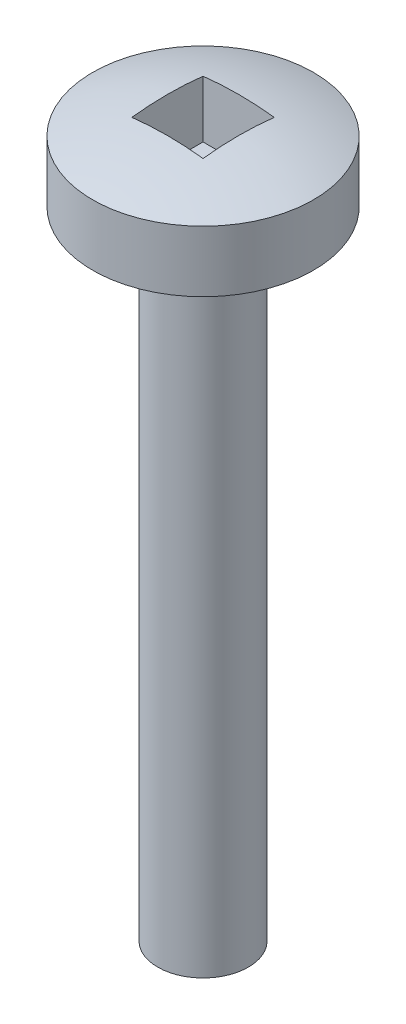
ISO-10303-21;
HEADER;
FILE_DESCRIPTION(('STEP AP214'),'2;1');
FILE_NAME('part.step','',(''),(''),'','','');
FILE_SCHEMA(('AUTOMOTIVE_DESIGN { 1 0 10303 214 1 1 1 1 }'));
ENDSEC;
DATA;
#1=APPLICATION_CONTEXT('core data for automotive mechanical design processes');
#2=APPLICATION_PROTOCOL_DEFINITION('international standard','automotive_design',2000,#1);
#3=PRODUCT_CONTEXT('',#1,'mechanical');
#4=PRODUCT('Part','Part','',(#3));
#5=PRODUCT_RELATED_PRODUCT_CATEGORY('part','',(#4));
#6=PRODUCT_DEFINITION_FORMATION('','',#4);
#7=PRODUCT_DEFINITION_CONTEXT('part definition',#1,'design');
#8=PRODUCT_DEFINITION('design','',#6,#7);
#9=PRODUCT_DEFINITION_SHAPE('','',#8);
#10=(LENGTH_UNIT() NAMED_UNIT(*) SI_UNIT(.MILLI.,.METRE.));
#11=(NAMED_UNIT(*) PLANE_ANGLE_UNIT() SI_UNIT($,.RADIAN.));
#12=(NAMED_UNIT(*) SI_UNIT($,.STERADIAN.) SOLID_ANGLE_UNIT());
#13=UNCERTAINTY_MEASURE_WITH_UNIT(LENGTH_MEASURE(1.E-05),#10,'distance_accuracy_value','');
#14=(GEOMETRIC_REPRESENTATION_CONTEXT(3) GLOBAL_UNCERTAINTY_ASSIGNED_CONTEXT((#13)) GLOBAL_UNIT_ASSIGNED_CONTEXT((#10,
#11,#12)) REPRESENTATION_CONTEXT('',''));
#15=CARTESIAN_POINT('',(0.,0.,0.));
#16=DIRECTION('',(0.,0.,1.));
#17=DIRECTION('',(1.,0.,0.));
#18=AXIS2_PLACEMENT_3D('',#15,#16,#17);
#19=CARTESIAN_POINT('',(0.,-15.875,0.));
#20=DIRECTION('',(0.,1.,0.));
#21=DIRECTION('',(0.,0.,1.));
#22=AXIS2_PLACEMENT_3D('',#19,#20,#21);
#23=CYLINDRICAL_SURFACE('',#22,1.1303);
#24=CARTESIAN_POINT('',(0.,-15.875,0.));
#25=DIRECTION('',(0.,1.,0.));
#26=DIRECTION('',(0.,0.,1.));
#27=AXIS2_PLACEMENT_3D('',#24,#25,#26);
#28=CIRCLE('',#27,1.1303);
#29=CARTESIAN_POINT('',(0.,-15.875,1.1303));
#30=VERTEX_POINT('',#29);
#31=EDGE_CURVE('E104',#30,#30,#28,.T.);
#32=ORIENTED_EDGE('',*,*,#31,.T.);
#33=EDGE_LOOP('',(#32));
#34=FACE_BOUND('',#33,.T.);
#35=CARTESIAN_POINT('',(0.,0.,0.));
#36=DIRECTION('',(0.,1.,0.));
#37=DIRECTION('',(0.,0.,1.));
#38=AXIS2_PLACEMENT_3D('',#35,#36,#37);
#39=CIRCLE('',#38,1.1303);
#40=CARTESIAN_POINT('',(0.,0.,1.1303));
#41=VERTEX_POINT('',#40);
#42=EDGE_CURVE('E108',#41,#41,#39,.T.);
#43=ORIENTED_EDGE('',*,*,#42,.F.);
#44=EDGE_LOOP('',(#43));
#45=FACE_BOUND('',#44,.T.);
#46=ADVANCED_FACE('F32',(#34,#45),#23,.T.);
#47=CARTESIAN_POINT('',(0.,-15.875,0.));
#48=DIRECTION('',(0.,1.,0.));
#49=DIRECTION('',(0.,0.,1.));
#50=AXIS2_PLACEMENT_3D('',#47,#48,#49);
#51=PLANE('',#50);
#52=ORIENTED_EDGE('',*,*,#31,.F.);
#53=EDGE_LOOP('',(#52));
#54=FACE_BOUND('',#53,.T.);
#55=ADVANCED_FACE('F128',(#54),#51,.F.);
#56=CARTESIAN_POINT('',(0.,1.524,0.));
#57=DIRECTION('',(0.,-1.,0.));
#58=DIRECTION('',(0.,0.,-1.));
#59=AXIS2_PLACEMENT_3D('',#56,#57,#58);
#60=CYLINDRICAL_SURFACE('',#59,2.7559);
#61=CARTESIAN_POINT('',(0.,1.524,0.));
#62=DIRECTION('',(0.,1.,0.));
#63=DIRECTION('',(0.,0.,1.));
#64=AXIS2_PLACEMENT_3D('',#61,#62,#63);
#65=CIRCLE('',#64,2.7559);
#66=CARTESIAN_POINT('',(0.,1.524,-2.7559));
#67=VERTEX_POINT('',#66);
#68=EDGE_CURVE('E103',#67,#67,#65,.T.);
#69=CARTESIAN_POINT('',(0.,0.,0.));
#70=DIRECTION('',(0.,1.,0.));
#71=DIRECTION('',(0.,0.,1.));
#72=AXIS2_PLACEMENT_3D('',#69,#70,#71);
#73=CIRCLE('',#72,2.7559);
#74=CARTESIAN_POINT('',(0.,0.,-2.7559));
#75=VERTEX_POINT('',#74);
#76=EDGE_CURVE('E97',#75,#75,#73,.T.);
#77=CARTESIAN_POINT('',(0.,1.524,-2.7559));
#78=CARTESIAN_POINT('',(0.,1.508125,-2.7559));
#79=CARTESIAN_POINT('',(0.,1.49225,-2.7559));
#80=CARTESIAN_POINT('',(0.,1.4605,-2.7559));
#81=CARTESIAN_POINT('',(0.,1.444625,-2.7559));
#82=CARTESIAN_POINT('',(0.,1.412875,-2.7559));
#83=CARTESIAN_POINT('',(0.,1.397,-2.7559));
#84=CARTESIAN_POINT('',(0.,1.36525,-2.7559));
#85=CARTESIAN_POINT('',(0.,1.349375,-2.7559));
#86=CARTESIAN_POINT('',(0.,1.317625,-2.7559));
#87=CARTESIAN_POINT('',(0.,1.30175,-2.7559));
#88=CARTESIAN_POINT('',(0.,1.27,-2.7559));
#89=CARTESIAN_POINT('',(0.,1.254125,-2.7559));
#90=CARTESIAN_POINT('',(0.,1.222375,-2.7559));
#91=CARTESIAN_POINT('',(0.,1.2065,-2.7559));
#92=CARTESIAN_POINT('',(0.,1.17475,-2.7559));
#93=CARTESIAN_POINT('',(0.,1.158875,-2.7559));
#94=CARTESIAN_POINT('',(0.,1.127125,-2.7559));
#95=CARTESIAN_POINT('',(0.,1.11125,-2.7559));
#96=CARTESIAN_POINT('',(0.,1.0795,-2.7559));
#97=CARTESIAN_POINT('',(0.,1.063625,-2.7559));
#98=CARTESIAN_POINT('',(0.,1.031875,-2.7559));
#99=CARTESIAN_POINT('',(0.,1.016,-2.7559));
#100=CARTESIAN_POINT('',(0.,0.98425,-2.7559));
#101=CARTESIAN_POINT('',(0.,0.968375,-2.7559));
#102=CARTESIAN_POINT('',(0.,0.936625,-2.7559));
#103=CARTESIAN_POINT('',(0.,0.92075,-2.7559));
#104=CARTESIAN_POINT('',(0.,0.889,-2.7559));
#105=CARTESIAN_POINT('',(0.,0.873125,-2.7559));
#106=CARTESIAN_POINT('',(0.,0.841375,-2.7559));
#107=CARTESIAN_POINT('',(0.,0.8255,-2.7559));
#108=CARTESIAN_POINT('',(0.,0.79375,-2.7559));
#109=CARTESIAN_POINT('',(0.,0.777875,-2.7559));
#110=CARTESIAN_POINT('',(0.,0.746125,-2.7559));
#111=CARTESIAN_POINT('',(0.,0.73025,-2.7559));
#112=CARTESIAN_POINT('',(0.,0.6985,-2.7559));
#113=CARTESIAN_POINT('',(0.,0.682625,-2.7559));
#114=CARTESIAN_POINT('',(0.,0.650875,-2.7559));
#115=CARTESIAN_POINT('',(0.,0.635,-2.7559));
#116=CARTESIAN_POINT('',(0.,0.60325,-2.7559));
#117=CARTESIAN_POINT('',(0.,0.587375,-2.7559));
#118=CARTESIAN_POINT('',(0.,0.555625,-2.7559));
#119=CARTESIAN_POINT('',(0.,0.53975,-2.7559));
#120=CARTESIAN_POINT('',(0.,0.508,-2.7559));
#121=CARTESIAN_POINT('',(0.,0.492125,-2.7559));
#122=CARTESIAN_POINT('',(0.,0.460375,-2.7559));
#123=CARTESIAN_POINT('',(0.,0.4445,-2.7559));
#124=CARTESIAN_POINT('',(0.,0.41275,-2.7559));
#125=CARTESIAN_POINT('',(0.,0.396875,-2.7559));
#126=CARTESIAN_POINT('',(0.,0.365125,-2.7559));
#127=CARTESIAN_POINT('',(0.,0.34925,-2.7559));
#128=CARTESIAN_POINT('',(0.,0.3175,-2.7559));
#129=CARTESIAN_POINT('',(0.,0.301625,-2.7559));
#130=CARTESIAN_POINT('',(0.,0.269875,-2.7559));
#131=CARTESIAN_POINT('',(0.,0.254,-2.7559));
#132=CARTESIAN_POINT('',(0.,0.22225,-2.7559));
#133=CARTESIAN_POINT('',(0.,0.206375,-2.7559));
#134=CARTESIAN_POINT('',(0.,0.174625,-2.7559));
#135=CARTESIAN_POINT('',(0.,0.15875,-2.7559));
#136=CARTESIAN_POINT('',(0.,0.127,-2.7559));
#137=CARTESIAN_POINT('',(0.,0.111125,-2.7559));
#138=CARTESIAN_POINT('',(0.,0.079375,-2.7559));
#139=CARTESIAN_POINT('',(0.,0.0635,-2.7559));
#140=CARTESIAN_POINT('',(0.,0.0317499999999999,-2.7559));
#141=CARTESIAN_POINT('',(0.,0.015875,-2.7559));
#142=CARTESIAN_POINT('',(0.,0.,-2.7559));
#143=B_SPLINE_CURVE_WITH_KNOTS('',3,(#77,#78,#79,#80,#81,#82,#83,#84,#85,#86,#87,#88,#89,#90,
#91,#92,#93,#94,#95,#96,#97,#98,#99,#100,#101,#102,#103,#104,#105,#106,#107,#108,#109,#110,#111,
#112,#113,#114,#115,#116,#117,#118,#119,#120,#121,#122,#123,#124,#125,#126,#127,#128,#129,#130,
#131,#132,#133,#134,#135,#136,#137,#138,#139,#140,#141,#142),.UNSPECIFIED.,.F.,.F.,(4,2,2,2,2,2,
2,2,2,2,2,2,2,2,2,2,2,2,2,2,2,2,2,2,2,2,2,2,2,2,2,2,4),(0.,0.0476250000000001,
0.0952500000000001,0.142875,0.1905,0.238125,0.28575,0.333375,0.381,0.428625,0.47625,0.523875,
0.5715,0.619125,0.66675,0.714375,0.762,0.809625,0.85725,0.904875,0.9525,1.000125,1.04775,
1.095375,1.143,1.190625,1.23825,1.285875,1.3335,1.381125,1.42875,1.476375,1.524),.UNSPECIFIED.);
#144=EDGE_CURVE('BSEAM123',#67,#75,#143,.T.);
#145=ORIENTED_EDGE('',*,*,#68,.F.);
#146=ORIENTED_EDGE('',*,*,#76,.T.);
#147=ORIENTED_EDGE('',*,*,#144,.T.);
#148=ORIENTED_EDGE('',*,*,#144,.F.);
#149=EDGE_LOOP('',(#145,#147,#146,#148));
#150=FACE_BOUND('',#149,.T.);
#151=ADVANCED_FACE('F123',(#150),#60,.T.);
#152=CARTESIAN_POINT('',(0.,-5.69737875,0.));
#153=DIRECTION('',(0.,0.,1.));
#154=DIRECTION('',(1.,0.,0.));
#155=AXIS2_PLACEMENT_3D('',#152,#153,#154);
#156=SPHERICAL_SURFACE('',#155,7.72937875);
#157=CARTESIAN_POINT('',(0.889,-5.69737875,0.));
#158=DIRECTION('',(1.,0.,0.));
#159=DIRECTION('',(0.,0.,-1.));
#160=AXIS2_PLACEMENT_3D('',#157,#158,#159);
#161=CIRCLE('',#160,7.67808406185759);
#162=CARTESIAN_POINT('',(0.889,1.92906562867028,0.889));
#163=VERTEX_POINT('',#162);
#164=CARTESIAN_POINT('',(0.889,1.92906562867028,-0.889));
#165=VERTEX_POINT('',#164);
#166=EDGE_CURVE('E11',#163,#165,#161,.F.);
#167=ORIENTED_EDGE('',*,*,#166,.F.);
#168=CARTESIAN_POINT('',(0.,-5.69737875,0.889));
#169=DIRECTION('',(0.,0.,1.));
#170=DIRECTION('',(1.,0.,0.));
#171=AXIS2_PLACEMENT_3D('',#168,#169,#170);
#172=CIRCLE('',#171,7.67808406185759);
#173=CARTESIAN_POINT('',(-0.889,1.92906562867028,0.888999999999999));
#174=VERTEX_POINT('',#173);
#175=EDGE_CURVE('E40',#174,#163,#172,.F.);
#176=ORIENTED_EDGE('',*,*,#175,.F.);
#177=CARTESIAN_POINT('',(-0.889,-5.69737875,0.));
#178=DIRECTION('',(-1.,0.,0.));
#179=DIRECTION('',(0.,0.,1.));
#180=AXIS2_PLACEMENT_3D('',#177,#178,#179);
#181=CIRCLE('',#180,7.67808406185759);
#182=CARTESIAN_POINT('',(-0.888999999999999,1.92906562867028,-0.889));
#183=VERTEX_POINT('',#182);
#184=EDGE_CURVE('E114',#183,#174,#181,.F.);
#185=ORIENTED_EDGE('',*,*,#184,.F.);
#186=CARTESIAN_POINT('',(0.,-5.69737875,-0.889));
#187=DIRECTION('',(0.,0.,-1.));
#188=DIRECTION('',(-1.,0.,0.));
#189=AXIS2_PLACEMENT_3D('',#186,#187,#188);
#190=CIRCLE('',#189,7.67808406185759);
#191=EDGE_CURVE('E107',#165,#183,#190,.F.);
#192=ORIENTED_EDGE('',*,*,#191,.F.);
#193=EDGE_LOOP('',(#167,#176,#185,#192));
#194=FACE_BOUND('',#193,.T.);
#195=ORIENTED_EDGE('',*,*,#68,.T.);
#196=EDGE_LOOP('',(#195));
#197=FACE_BOUND('',#196,.T.);
#198=ADVANCED_FACE('F34',(#194,#197),#156,.T.);
#199=CARTESIAN_POINT('',(0.,0.,0.));
#200=DIRECTION('',(0.,1.,0.));
#201=DIRECTION('',(0.,0.,1.));
#202=AXIS2_PLACEMENT_3D('',#199,#200,#201);
#203=PLANE('',#202);
#204=ORIENTED_EDGE('',*,*,#42,.T.);
#205=EDGE_LOOP('',(#204));
#206=FACE_BOUND('',#205,.T.);
#207=ORIENTED_EDGE('',*,*,#76,.F.);
#208=EDGE_LOOP('',(#207));
#209=FACE_BOUND('',#208,.T.);
#210=ADVANCED_FACE('F122',(#206,#209),#203,.F.);
#211=CARTESIAN_POINT('',(0.889,0.508,0.889));
#212=DIRECTION('',(1.,0.,0.));
#213=DIRECTION('',(0.,0.,-1.));
#214=AXIS2_PLACEMENT_3D('',#211,#212,#213);
#215=PLANE('',#214);
#216=ORIENTED_EDGE('',*,*,#166,.T.);
#217=DIRECTION('',(0.,1.,0.));
#218=VECTOR('',#217,1.);
#219=CARTESIAN_POINT('',(0.889,0.508,-0.889));
#220=LINE('',#219,#218);
#221=CARTESIAN_POINT('',(0.889,0.508,-0.889));
#222=VERTEX_POINT('',#221);
#223=EDGE_CURVE('E47',#222,#165,#220,.T.);
#224=ORIENTED_EDGE('',*,*,#223,.F.);
#225=DIRECTION('',(0.,0.,-1.));
#226=VECTOR('',#225,1.);
#227=CARTESIAN_POINT('',(0.889,0.508,0.889));
#228=LINE('',#227,#226);
#229=CARTESIAN_POINT('',(0.889,0.508,0.889));
#230=VERTEX_POINT('',#229);
#231=EDGE_CURVE('E73',#230,#222,#228,.T.);
#232=ORIENTED_EDGE('',*,*,#231,.F.);
#233=DIRECTION('',(0.,1.,0.));
#234=VECTOR('',#233,1.);
#235=CARTESIAN_POINT('',(0.889,0.508,0.889));
#236=LINE('',#235,#234);
#237=EDGE_CURVE('E95',#230,#163,#236,.T.);
#238=ORIENTED_EDGE('',*,*,#237,.T.);
#239=EDGE_LOOP('',(#216,#224,#232,#238));
#240=FACE_BOUND('',#239,.T.);
#241=ADVANCED_FACE('F71',(#240),#215,.F.);
#242=CARTESIAN_POINT('',(-0.889,0.508,0.889));
#243=DIRECTION('',(0.,0.,1.));
#244=DIRECTION('',(1.,0.,0.));
#245=AXIS2_PLACEMENT_3D('',#242,#243,#244);
#246=PLANE('',#245);
#247=ORIENTED_EDGE('',*,*,#175,.T.);
#248=ORIENTED_EDGE('',*,*,#237,.F.);
#249=DIRECTION('',(1.,0.,0.));
#250=VECTOR('',#249,1.);
#251=CARTESIAN_POINT('',(-0.889,0.508,0.889));
#252=LINE('',#251,#250);
#253=CARTESIAN_POINT('',(-0.889,0.508,0.889));
#254=VERTEX_POINT('',#253);
#255=EDGE_CURVE('E78',#254,#230,#252,.T.);
#256=ORIENTED_EDGE('',*,*,#255,.F.);
#257=DIRECTION('',(0.,1.,0.));
#258=VECTOR('',#257,1.);
#259=CARTESIAN_POINT('',(-0.889,0.508,0.889));
#260=LINE('',#259,#258);
#261=EDGE_CURVE('E98',#254,#174,#260,.T.);
#262=ORIENTED_EDGE('',*,*,#261,.T.);
#263=EDGE_LOOP('',(#247,#248,#256,#262));
#264=FACE_BOUND('',#263,.T.);
#265=ADVANCED_FACE('F119',(#264),#246,.F.);
#266=CARTESIAN_POINT('',(-0.889,0.508,0.889));
#267=DIRECTION('',(-1.,0.,0.));
#268=DIRECTION('',(0.,0.,1.));
#269=AXIS2_PLACEMENT_3D('',#266,#267,#268);
#270=PLANE('',#269);
#271=ORIENTED_EDGE('',*,*,#184,.T.);
#272=ORIENTED_EDGE('',*,*,#261,.F.);
#273=DIRECTION('',(0.,0.,1.));
#274=VECTOR('',#273,1.);
#275=CARTESIAN_POINT('',(-0.889,0.508,0.889));
#276=LINE('',#275,#274);
#277=CARTESIAN_POINT('',(-0.889,0.508,-0.889));
#278=VERTEX_POINT('',#277);
#279=EDGE_CURVE('E87',#278,#254,#276,.T.);
#280=ORIENTED_EDGE('',*,*,#279,.F.);
#281=DIRECTION('',(0.,1.,0.));
#282=VECTOR('',#281,1.);
#283=CARTESIAN_POINT('',(-0.889,0.508,-0.889));
#284=LINE('',#283,#282);
#285=EDGE_CURVE('E77',#278,#183,#284,.T.);
#286=ORIENTED_EDGE('',*,*,#285,.T.);
#287=EDGE_LOOP('',(#271,#272,#280,#286));
#288=FACE_BOUND('',#287,.T.);
#289=ADVANCED_FACE('F117',(#288),#270,.F.);
#290=CARTESIAN_POINT('',(-0.889,0.508,-0.889));
#291=DIRECTION('',(0.,0.,-1.));
#292=DIRECTION('',(-1.,0.,0.));
#293=AXIS2_PLACEMENT_3D('',#290,#291,#292);
#294=PLANE('',#293);
#295=ORIENTED_EDGE('',*,*,#191,.T.);
#296=ORIENTED_EDGE('',*,*,#285,.F.);
#297=DIRECTION('',(-1.,0.,0.));
#298=VECTOR('',#297,1.);
#299=CARTESIAN_POINT('',(-0.889,0.508,-0.889));
#300=LINE('',#299,#298);
#301=EDGE_CURVE('E81',#222,#278,#300,.T.);
#302=ORIENTED_EDGE('',*,*,#301,.F.);
#303=ORIENTED_EDGE('',*,*,#223,.T.);
#304=EDGE_LOOP('',(#295,#296,#302,#303));
#305=FACE_BOUND('',#304,.T.);
#306=ADVANCED_FACE('F82',(#305),#294,.F.);
#307=CARTESIAN_POINT('',(0.,0.508,0.));
#308=DIRECTION('',(0.,-1.,0.));
#309=DIRECTION('',(0.,0.,-1.));
#310=AXIS2_PLACEMENT_3D('',#307,#308,#309);
#311=PLANE('',#310);
#312=ORIENTED_EDGE('',*,*,#231,.T.);
#313=ORIENTED_EDGE('',*,*,#301,.T.);
#314=ORIENTED_EDGE('',*,*,#279,.T.);
#315=ORIENTED_EDGE('',*,*,#255,.T.);
#316=EDGE_LOOP('',(#312,#313,#314,#315));
#317=FACE_BOUND('',#316,.T.);
#318=ADVANCED_FACE('F89',(#317),#311,.F.);
#319=CLOSED_SHELL('',(#46,#55,#151,#198,#210,#241,#265,#289,#306,#318));
#320=MANIFOLD_SOLID_BREP('B2',#319);
#321=ADVANCED_BREP_SHAPE_REPRESENTATION('',(#18,#320),#14);
#322=SHAPE_DEFINITION_REPRESENTATION(#9,#321);
ENDSEC;
END-ISO-10303-21;
